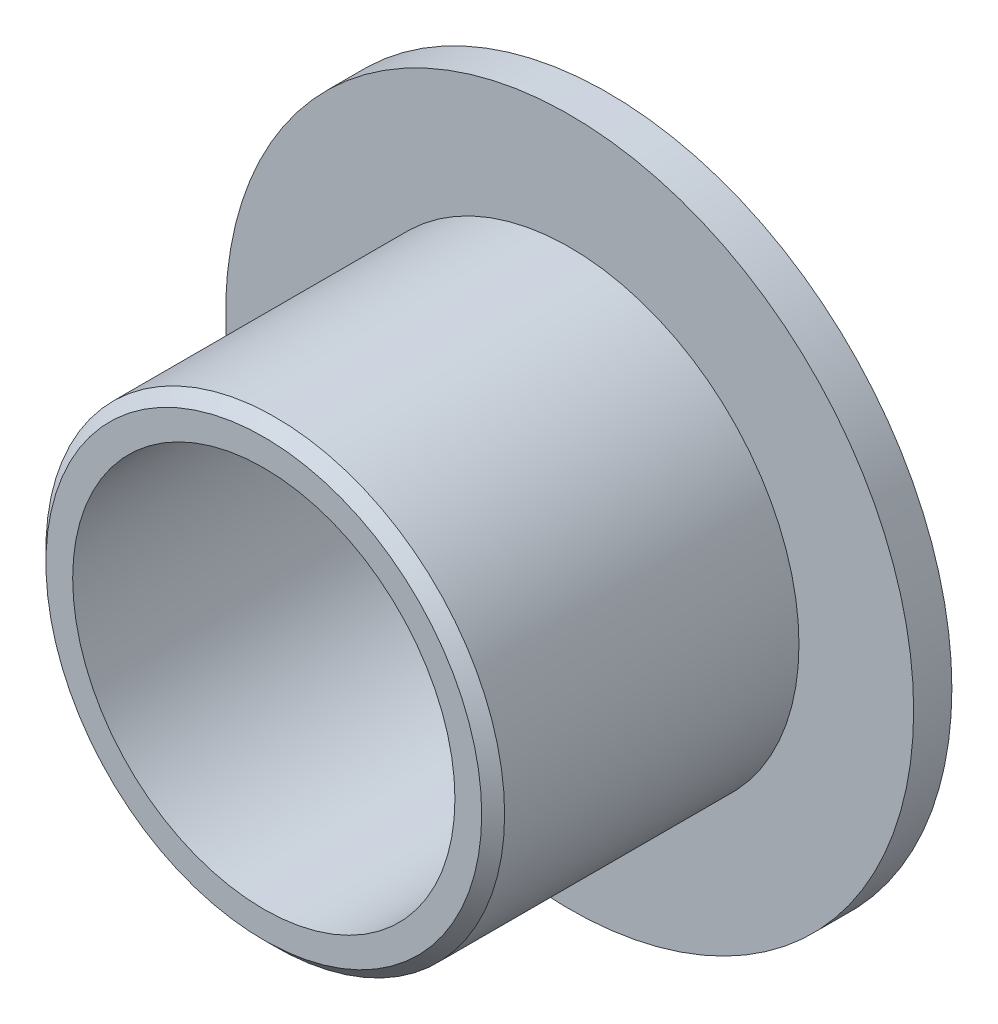
ISO-10303-21;
HEADER;
FILE_DESCRIPTION(('STEP AP214'),'2;1');
FILE_NAME('part.step','',(''),(''),'','','');
FILE_SCHEMA(('AUTOMOTIVE_DESIGN { 1 0 10303 214 1 1 1 1 }'));
ENDSEC;
DATA;
#1=APPLICATION_CONTEXT('core data for automotive mechanical design processes');
#2=APPLICATION_PROTOCOL_DEFINITION('international standard','automotive_design',2000,#1);
#3=PRODUCT_CONTEXT('',#1,'mechanical');
#4=PRODUCT('Part','Part','',(#3));
#5=PRODUCT_RELATED_PRODUCT_CATEGORY('part','',(#4));
#6=PRODUCT_DEFINITION_FORMATION('','',#4);
#7=PRODUCT_DEFINITION_CONTEXT('part definition',#1,'design');
#8=PRODUCT_DEFINITION('design','',#6,#7);
#9=PRODUCT_DEFINITION_SHAPE('','',#8);
#10=(LENGTH_UNIT() NAMED_UNIT(*) SI_UNIT(.MILLI.,.METRE.));
#11=(NAMED_UNIT(*) PLANE_ANGLE_UNIT() SI_UNIT($,.RADIAN.));
#12=(NAMED_UNIT(*) SI_UNIT($,.STERADIAN.) SOLID_ANGLE_UNIT());
#13=UNCERTAINTY_MEASURE_WITH_UNIT(LENGTH_MEASURE(1.E-05),#10,'distance_accuracy_value','');
#14=(GEOMETRIC_REPRESENTATION_CONTEXT(3) GLOBAL_UNCERTAINTY_ASSIGNED_CONTEXT((#13)) GLOBAL_UNIT_ASSIGNED_CONTEXT((#10,
#11,#12)) REPRESENTATION_CONTEXT('',''));
#15=CARTESIAN_POINT('',(0.,0.,0.));
#16=DIRECTION('',(0.,0.,1.));
#17=DIRECTION('',(1.,0.,0.));
#18=AXIS2_PLACEMENT_3D('',#15,#16,#17);
#19=CARTESIAN_POINT('',(0.,0.,1.));
#20=DIRECTION('',(0.,0.,1.));
#21=DIRECTION('',(1.,0.,0.));
#22=AXIS2_PLACEMENT_3D('',#19,#20,#21);
#23=PLANE('',#22);
#24=CARTESIAN_POINT('',(0.,0.,1.));
#25=DIRECTION('',(0.,0.,1.));
#26=DIRECTION('',(1.,0.,0.));
#27=AXIS2_PLACEMENT_3D('',#24,#25,#26);
#28=CIRCLE('',#27,9.);
#29=CARTESIAN_POINT('',(9.,0.,1.));
#30=VERTEX_POINT('',#29);
#31=EDGE_CURVE('E56',#30,#30,#28,.T.);
#32=ORIENTED_EDGE('',*,*,#31,.T.);
#33=EDGE_LOOP('',(#32));
#34=FACE_BOUND('',#33,.T.);
#35=CARTESIAN_POINT('',(0.,0.,1.));
#36=DIRECTION('',(0.,0.,1.));
#37=DIRECTION('',(1.,0.,0.));
#38=AXIS2_PLACEMENT_3D('',#35,#36,#37);
#39=CIRCLE('',#38,6.);
#40=CARTESIAN_POINT('',(6.,0.,1.));
#41=VERTEX_POINT('',#40);
#42=EDGE_CURVE('E71',#41,#41,#39,.T.);
#43=ORIENTED_EDGE('',*,*,#42,.F.);
#44=EDGE_LOOP('',(#43));
#45=FACE_BOUND('',#44,.T.);
#46=ADVANCED_FACE('F42',(#34,#45),#23,.T.);
#47=CARTESIAN_POINT('',(0.,0.,0.));
#48=DIRECTION('',(0.,0.,1.));
#49=DIRECTION('',(1.,0.,0.));
#50=AXIS2_PLACEMENT_3D('',#47,#48,#49);
#51=PLANE('',#50);
#52=CARTESIAN_POINT('',(0.,0.,0.));
#53=DIRECTION('',(0.,0.,1.));
#54=DIRECTION('',(1.,0.,0.));
#55=AXIS2_PLACEMENT_3D('',#52,#53,#54);
#56=CIRCLE('',#55,9.);
#57=CARTESIAN_POINT('',(9.,0.,0.));
#58=VERTEX_POINT('',#57);
#59=EDGE_CURVE('E61',#58,#58,#56,.T.);
#60=ORIENTED_EDGE('',*,*,#59,.F.);
#61=EDGE_LOOP('',(#60));
#62=FACE_BOUND('',#61,.T.);
#63=CARTESIAN_POINT('',(0.,0.,0.));
#64=DIRECTION('',(0.,0.,1.));
#65=DIRECTION('',(1.,0.,0.));
#66=AXIS2_PLACEMENT_3D('',#63,#64,#65);
#67=CIRCLE('',#66,5.);
#68=CARTESIAN_POINT('',(5.,0.,0.));
#69=VERTEX_POINT('',#68);
#70=EDGE_CURVE('E66',#69,#69,#67,.T.);
#71=ORIENTED_EDGE('',*,*,#70,.T.);
#72=EDGE_LOOP('',(#71));
#73=FACE_BOUND('',#72,.T.);
#74=ADVANCED_FACE('F96',(#62,#73),#51,.F.);
#75=CARTESIAN_POINT('',(0.,0.,1.));
#76=DIRECTION('',(0.,0.,-1.));
#77=DIRECTION('',(-1.,0.,0.));
#78=AXIS2_PLACEMENT_3D('',#75,#76,#77);
#79=CYLINDRICAL_SURFACE('',#78,9.);
#80=ORIENTED_EDGE('',*,*,#31,.F.);
#81=EDGE_LOOP('',(#80));
#82=FACE_BOUND('',#81,.T.);
#83=ORIENTED_EDGE('',*,*,#59,.T.);
#84=EDGE_LOOP('',(#83));
#85=FACE_BOUND('',#84,.T.);
#86=ADVANCED_FACE('F92',(#82,#85),#79,.T.);
#87=CARTESIAN_POINT('',(0.,0.,1.));
#88=DIRECTION('',(0.,0.,-1.));
#89=DIRECTION('',(-1.,0.,0.));
#90=AXIS2_PLACEMENT_3D('',#87,#88,#89);
#91=CYLINDRICAL_SURFACE('',#90,5.);
#92=ORIENTED_EDGE('',*,*,#70,.F.);
#93=EDGE_LOOP('',(#92));
#94=FACE_BOUND('',#93,.T.);
#95=CARTESIAN_POINT('',(0.,0.,9.));
#96=DIRECTION('',(0.,0.,1.));
#97=DIRECTION('',(1.,0.,0.));
#98=AXIS2_PLACEMENT_3D('',#95,#96,#97);
#99=CIRCLE('',#98,5.);
#100=CARTESIAN_POINT('',(5.,0.,9.));
#101=VERTEX_POINT('',#100);
#102=EDGE_CURVE('E75',#101,#101,#99,.T.);
#103=ORIENTED_EDGE('',*,*,#102,.T.);
#104=EDGE_LOOP('',(#103));
#105=FACE_BOUND('',#104,.T.);
#106=ADVANCED_FACE('F80',(#94,#105),#91,.F.);
#107=CARTESIAN_POINT('',(0.,0.,9.));
#108=DIRECTION('',(0.,0.,1.));
#109=DIRECTION('',(1.,0.,0.));
#110=AXIS2_PLACEMENT_3D('',#107,#108,#109);
#111=PLANE('',#110);
#112=CARTESIAN_POINT('',(0.,0.,9.));
#113=DIRECTION('',(0.,0.,1.));
#114=DIRECTION('',(1.,0.,0.));
#115=AXIS2_PLACEMENT_3D('',#112,#113,#114);
#116=CIRCLE('',#115,5.69999999999999);
#117=CARTESIAN_POINT('',(5.69999999999999,0.,9.));
#118=VERTEX_POINT('',#117);
#119=EDGE_CURVE('E51',#118,#118,#116,.T.);
#120=ORIENTED_EDGE('',*,*,#119,.T.);
#121=EDGE_LOOP('',(#120));
#122=FACE_BOUND('',#121,.T.);
#123=ORIENTED_EDGE('',*,*,#102,.F.);
#124=EDGE_LOOP('',(#123));
#125=FACE_BOUND('',#124,.T.);
#126=ADVANCED_FACE('F82',(#122,#125),#111,.T.);
#127=CARTESIAN_POINT('',(0.,0.,9.));
#128=DIRECTION('',(0.,0.,-1.));
#129=DIRECTION('',(-1.,0.,0.));
#130=AXIS2_PLACEMENT_3D('',#127,#128,#129);
#131=CYLINDRICAL_SURFACE('',#130,6.);
#132=CARTESIAN_POINT('',(0.,0.,8.69999999999999));
#133=DIRECTION('',(0.,0.,1.));
#134=DIRECTION('',(1.,0.,0.));
#135=AXIS2_PLACEMENT_3D('',#132,#133,#134);
#136=CIRCLE('',#135,6.);
#137=CARTESIAN_POINT('',(6.,0.,8.69999999999999));
#138=VERTEX_POINT('',#137);
#139=EDGE_CURVE('E10',#138,#138,#136,.F.);
#140=ORIENTED_EDGE('',*,*,#139,.T.);
#141=EDGE_LOOP('',(#140));
#142=FACE_BOUND('',#141,.T.);
#143=ORIENTED_EDGE('',*,*,#42,.T.);
#144=EDGE_LOOP('',(#143));
#145=FACE_BOUND('',#144,.T.);
#146=ADVANCED_FACE('F84',(#142,#145),#131,.T.);
#147=CARTESIAN_POINT('',(0.,0.,9.));
#148=DIRECTION('',(0.,0.,-1.));
#149=DIRECTION('',(-1.,0.,0.));
#150=AXIS2_PLACEMENT_3D('',#147,#148,#149);
#151=CONICAL_SURFACE('',#150,5.69999999999999,0.785398163397447);
#152=ORIENTED_EDGE('',*,*,#139,.F.);
#153=EDGE_LOOP('',(#152));
#154=FACE_BOUND('',#153,.T.);
#155=ORIENTED_EDGE('',*,*,#119,.F.);
#156=EDGE_LOOP('',(#155));
#157=FACE_BOUND('',#156,.T.);
#158=ADVANCED_FACE('F45',(#154,#157),#151,.T.);
#159=CLOSED_SHELL('',(#46,#74,#86,#106,#126,#146,#158));
#160=MANIFOLD_SOLID_BREP('B2',#159);
#161=ADVANCED_BREP_SHAPE_REPRESENTATION('',(#18,#160),#14);
#162=SHAPE_DEFINITION_REPRESENTATION(#9,#161);
ENDSEC;
END-ISO-10303-21;
